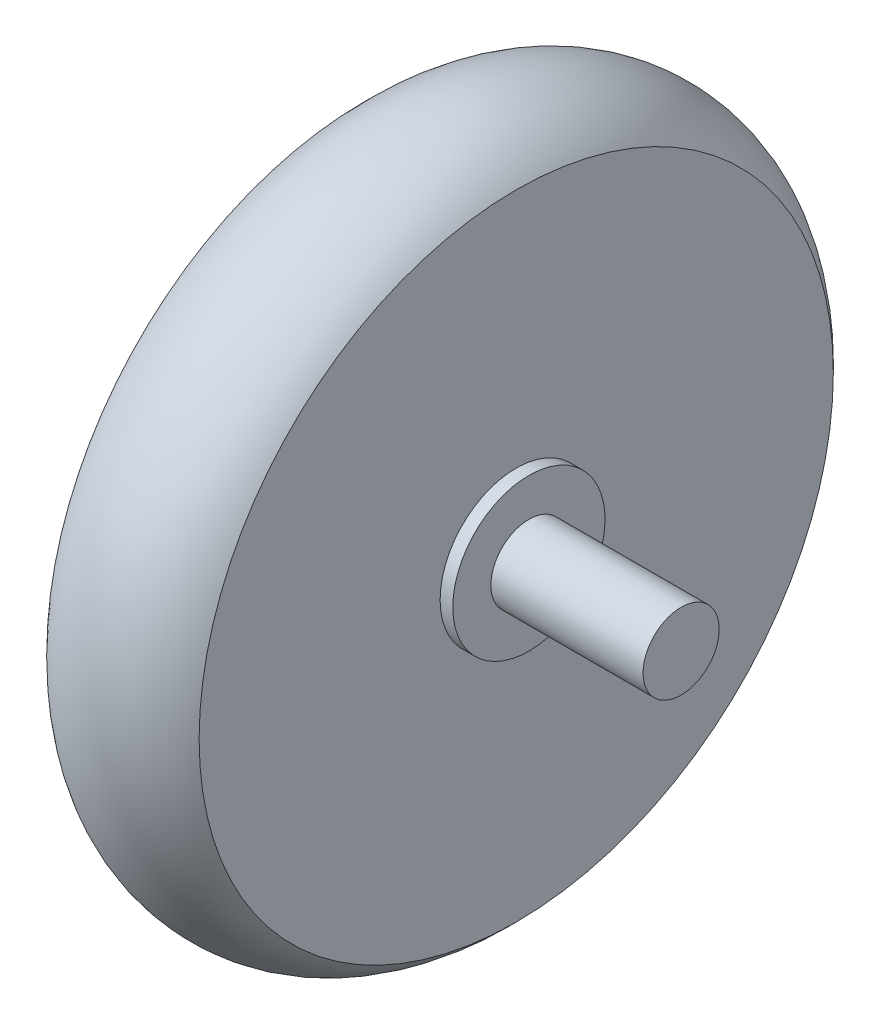
ISO-10303-21;
HEADER;
FILE_DESCRIPTION(('STEP AP214'),'2;1');
FILE_NAME('part.step','',(''),(''),'','','');
FILE_SCHEMA(('AUTOMOTIVE_DESIGN { 1 0 10303 214 1 1 1 1 }'));
ENDSEC;
DATA;
#1=APPLICATION_CONTEXT('core data for automotive mechanical design processes');
#2=APPLICATION_PROTOCOL_DEFINITION('international standard','automotive_design',2000,#1);
#3=PRODUCT_CONTEXT('',#1,'mechanical');
#4=PRODUCT('Part','Part','',(#3));
#5=PRODUCT_RELATED_PRODUCT_CATEGORY('part','',(#4));
#6=PRODUCT_DEFINITION_FORMATION('','',#4);
#7=PRODUCT_DEFINITION_CONTEXT('part definition',#1,'design');
#8=PRODUCT_DEFINITION('design','',#6,#7);
#9=PRODUCT_DEFINITION_SHAPE('','',#8);
#10=(LENGTH_UNIT() NAMED_UNIT(*) SI_UNIT(.MILLI.,.METRE.));
#11=(NAMED_UNIT(*) PLANE_ANGLE_UNIT() SI_UNIT($,.RADIAN.));
#12=(NAMED_UNIT(*) SI_UNIT($,.STERADIAN.) SOLID_ANGLE_UNIT());
#13=UNCERTAINTY_MEASURE_WITH_UNIT(LENGTH_MEASURE(1.E-05),#10,'distance_accuracy_value','');
#14=(GEOMETRIC_REPRESENTATION_CONTEXT(3) GLOBAL_UNCERTAINTY_ASSIGNED_CONTEXT((#13)) GLOBAL_UNIT_ASSIGNED_CONTEXT((#10,
#11,#12)) REPRESENTATION_CONTEXT('',''));
#15=CARTESIAN_POINT('',(0.,0.,0.));
#16=DIRECTION('',(0.,0.,1.));
#17=DIRECTION('',(1.,0.,0.));
#18=AXIS2_PLACEMENT_3D('',#15,#16,#17);
#19=CARTESIAN_POINT('',(12.,0.,0.));
#20=DIRECTION('',(1.,0.,0.));
#21=DIRECTION('',(0.,0.,-1.));
#22=AXIS2_PLACEMENT_3D('',#19,#20,#21);
#23=PLANE('',#22);
#24=CARTESIAN_POINT('',(12.,0.,0.));
#25=DIRECTION('',(-1.,0.,0.));
#26=DIRECTION('',(0.,0.,1.));
#27=AXIS2_PLACEMENT_3D('',#24,#25,#26);
#28=CIRCLE('',#27,6.);
#29=CARTESIAN_POINT('',(12.,0.,6.));
#30=VERTEX_POINT('',#29);
#31=EDGE_CURVE('E63',#30,#30,#28,.T.);
#32=ORIENTED_EDGE('',*,*,#31,.T.);
#33=EDGE_LOOP('',(#32));
#34=FACE_BOUND('',#33,.T.);
#35=CARTESIAN_POINT('',(12.,0.,0.));
#36=DIRECTION('',(-1.,0.,0.));
#37=DIRECTION('',(0.,0.,1.));
#38=AXIS2_PLACEMENT_3D('',#35,#36,#37);
#39=CIRCLE('',#38,25.);
#40=CARTESIAN_POINT('',(12.,0.,25.));
#41=VERTEX_POINT('',#40);
#42=EDGE_CURVE('E10',#41,#41,#39,.T.);
#43=ORIENTED_EDGE('',*,*,#42,.F.);
#44=EDGE_LOOP('',(#43));
#45=FACE_BOUND('',#44,.T.);
#46=ADVANCED_FACE('F35',(#34,#45),#23,.T.);
#47=CARTESIAN_POINT('',(6.,0.,0.));
#48=DIRECTION('',(-1.,0.,0.));
#49=DIRECTION('',(0.,0.,1.));
#50=AXIS2_PLACEMENT_3D('',#47,#48,#49);
#51=TOROIDAL_SURFACE('',#50,19.7084973778708,8.);
#52=CARTESIAN_POINT('',(0.,0.,0.));
#53=DIRECTION('',(-1.,0.,0.));
#54=DIRECTION('',(0.,0.,1.));
#55=AXIS2_PLACEMENT_3D('',#52,#53,#54);
#56=CIRCLE('',#55,25.);
#57=CARTESIAN_POINT('',(0.,0.,25.));
#58=VERTEX_POINT('',#57);
#59=EDGE_CURVE('E41',#58,#58,#56,.T.);
#60=ORIENTED_EDGE('',*,*,#59,.F.);
#61=EDGE_LOOP('',(#60));
#62=FACE_BOUND('',#61,.T.);
#63=ORIENTED_EDGE('',*,*,#42,.T.);
#64=EDGE_LOOP('',(#63));
#65=FACE_BOUND('',#64,.T.);
#66=ADVANCED_FACE('F81',(#62,#65),#51,.T.);
#67=CARTESIAN_POINT('',(0.,0.,0.));
#68=DIRECTION('',(-1.,0.,0.));
#69=DIRECTION('',(0.,0.,1.));
#70=AXIS2_PLACEMENT_3D('',#67,#68,#69);
#71=PLANE('',#70);
#72=ORIENTED_EDGE('',*,*,#59,.T.);
#73=EDGE_LOOP('',(#72));
#74=FACE_BOUND('',#73,.T.);
#75=CARTESIAN_POINT('',(0.,0.,0.));
#76=DIRECTION('',(-1.,0.,0.));
#77=DIRECTION('',(0.,0.,1.));
#78=AXIS2_PLACEMENT_3D('',#75,#76,#77);
#79=CIRCLE('',#78,10.);
#80=CARTESIAN_POINT('',(0.,0.,10.));
#81=VERTEX_POINT('',#80);
#82=EDGE_CURVE('E45',#81,#81,#79,.T.);
#83=ORIENTED_EDGE('',*,*,#82,.F.);
#84=EDGE_LOOP('',(#83));
#85=FACE_BOUND('',#84,.T.);
#86=ADVANCED_FACE('F85',(#74,#85),#71,.T.);
#87=CARTESIAN_POINT('',(0.,0.,0.));
#88=DIRECTION('',(-1.,0.,0.));
#89=DIRECTION('',(0.,0.,1.));
#90=AXIS2_PLACEMENT_3D('',#87,#88,#89);
#91=CYLINDRICAL_SURFACE('',#90,10.);
#92=CARTESIAN_POINT('',(2.,0.,0.));
#93=DIRECTION('',(-1.,0.,0.));
#94=DIRECTION('',(0.,0.,1.));
#95=AXIS2_PLACEMENT_3D('',#92,#93,#94);
#96=CIRCLE('',#95,10.);
#97=CARTESIAN_POINT('',(2.,0.,10.));
#98=VERTEX_POINT('',#97);
#99=EDGE_CURVE('E49',#98,#98,#96,.T.);
#100=ORIENTED_EDGE('',*,*,#99,.F.);
#101=EDGE_LOOP('',(#100));
#102=FACE_BOUND('',#101,.T.);
#103=ORIENTED_EDGE('',*,*,#82,.T.);
#104=EDGE_LOOP('',(#103));
#105=FACE_BOUND('',#104,.T.);
#106=ADVANCED_FACE('F90',(#102,#105),#91,.F.);
#107=CARTESIAN_POINT('',(2.,0.,0.));
#108=DIRECTION('',(1.,0.,0.));
#109=DIRECTION('',(0.,0.,-1.));
#110=AXIS2_PLACEMENT_3D('',#107,#108,#109);
#111=PLANE('',#110);
#112=ORIENTED_EDGE('',*,*,#99,.T.);
#113=EDGE_LOOP('',(#112));
#114=FACE_BOUND('',#113,.T.);
#115=ADVANCED_FACE('F95',(#114),#111,.F.);
#116=CARTESIAN_POINT('',(25.,0.,0.));
#117=DIRECTION('',(1.,0.,0.));
#118=DIRECTION('',(0.,0.,-1.));
#119=AXIS2_PLACEMENT_3D('',#116,#117,#118);
#120=PLANE('',#119);
#121=CARTESIAN_POINT('',(25.,0.,0.));
#122=DIRECTION('',(-1.,0.,0.));
#123=DIRECTION('',(0.,0.,1.));
#124=AXIS2_PLACEMENT_3D('',#121,#122,#123);
#125=CIRCLE('',#124,3.);
#126=CARTESIAN_POINT('',(25.,0.,3.));
#127=VERTEX_POINT('',#126);
#128=EDGE_CURVE('E54',#127,#127,#125,.T.);
#129=ORIENTED_EDGE('',*,*,#128,.F.);
#130=EDGE_LOOP('',(#129));
#131=FACE_BOUND('',#130,.T.);
#132=ADVANCED_FACE('F99',(#131),#120,.T.);
#133=CARTESIAN_POINT('',(0.,0.,0.));
#134=DIRECTION('',(-1.,0.,0.));
#135=DIRECTION('',(0.,0.,1.));
#136=AXIS2_PLACEMENT_3D('',#133,#134,#135);
#137=CYLINDRICAL_SURFACE('',#136,3.);
#138=ORIENTED_EDGE('',*,*,#128,.T.);
#139=EDGE_LOOP('',(#138));
#140=FACE_BOUND('',#139,.T.);
#141=CARTESIAN_POINT('',(13.,0.,0.));
#142=DIRECTION('',(-1.,0.,0.));
#143=DIRECTION('',(0.,0.,1.));
#144=AXIS2_PLACEMENT_3D('',#141,#142,#143);
#145=CIRCLE('',#144,3.);
#146=CARTESIAN_POINT('',(13.,0.,3.));
#147=VERTEX_POINT('',#146);
#148=EDGE_CURVE('E57',#147,#147,#145,.T.);
#149=ORIENTED_EDGE('',*,*,#148,.F.);
#150=EDGE_LOOP('',(#149));
#151=FACE_BOUND('',#150,.T.);
#152=ADVANCED_FACE('F77',(#140,#151),#137,.T.);
#153=CARTESIAN_POINT('',(13.,0.,0.));
#154=DIRECTION('',(1.,0.,0.));
#155=DIRECTION('',(0.,0.,-1.));
#156=AXIS2_PLACEMENT_3D('',#153,#154,#155);
#157=PLANE('',#156);
#158=ORIENTED_EDGE('',*,*,#148,.T.);
#159=EDGE_LOOP('',(#158));
#160=FACE_BOUND('',#159,.T.);
#161=CARTESIAN_POINT('',(13.,0.,0.));
#162=DIRECTION('',(-1.,0.,0.));
#163=DIRECTION('',(0.,0.,1.));
#164=AXIS2_PLACEMENT_3D('',#161,#162,#163);
#165=CIRCLE('',#164,6.);
#166=CARTESIAN_POINT('',(13.,0.,6.));
#167=VERTEX_POINT('',#166);
#168=EDGE_CURVE('E60',#167,#167,#165,.T.);
#169=ORIENTED_EDGE('',*,*,#168,.F.);
#170=EDGE_LOOP('',(#169));
#171=FACE_BOUND('',#170,.T.);
#172=ADVANCED_FACE('F71',(#160,#171),#157,.T.);
#173=CARTESIAN_POINT('',(0.,0.,0.));
#174=DIRECTION('',(-1.,0.,0.));
#175=DIRECTION('',(0.,0.,1.));
#176=AXIS2_PLACEMENT_3D('',#173,#174,#175);
#177=CYLINDRICAL_SURFACE('',#176,6.);
#178=ORIENTED_EDGE('',*,*,#168,.T.);
#179=EDGE_LOOP('',(#178));
#180=FACE_BOUND('',#179,.T.);
#181=ORIENTED_EDGE('',*,*,#31,.F.);
#182=EDGE_LOOP('',(#181));
#183=FACE_BOUND('',#182,.T.);
#184=ADVANCED_FACE('F69',(#180,#183),#177,.T.);
#185=CLOSED_SHELL('',(#46,#66,#86,#106,#115,#132,#152,#172,#184));
#186=MANIFOLD_SOLID_BREP('B2',#185);
#187=ADVANCED_BREP_SHAPE_REPRESENTATION('',(#18,#186),#14);
#188=SHAPE_DEFINITION_REPRESENTATION(#9,#187);
ENDSEC;
END-ISO-10303-21;
